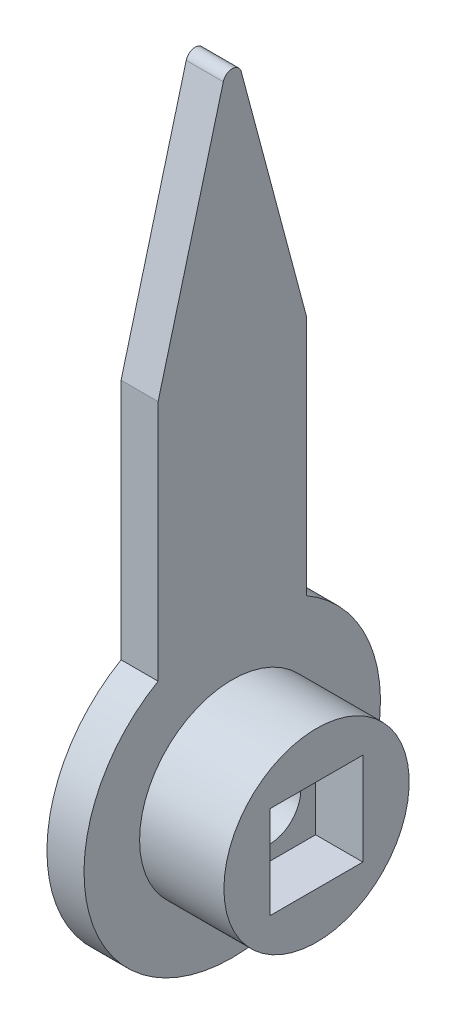
ISO-10303-21;
HEADER;
FILE_DESCRIPTION(('STEP AP214'),'2;1');
FILE_NAME('part.step','',(''),(''),'','','');
FILE_SCHEMA(('AUTOMOTIVE_DESIGN { 1 0 10303 214 1 1 1 1 }'));
ENDSEC;
DATA;
#1=APPLICATION_CONTEXT('core data for automotive mechanical design processes');
#2=APPLICATION_PROTOCOL_DEFINITION('international standard','automotive_design',2000,#1);
#3=PRODUCT_CONTEXT('',#1,'mechanical');
#4=PRODUCT('Part','Part','',(#3));
#5=PRODUCT_RELATED_PRODUCT_CATEGORY('part','',(#4));
#6=PRODUCT_DEFINITION_FORMATION('','',#4);
#7=PRODUCT_DEFINITION_CONTEXT('part definition',#1,'design');
#8=PRODUCT_DEFINITION('design','',#6,#7);
#9=PRODUCT_DEFINITION_SHAPE('','',#8);
#10=(LENGTH_UNIT() NAMED_UNIT(*) SI_UNIT(.MILLI.,.METRE.));
#11=(NAMED_UNIT(*) PLANE_ANGLE_UNIT() SI_UNIT($,.RADIAN.));
#12=(NAMED_UNIT(*) SI_UNIT($,.STERADIAN.) SOLID_ANGLE_UNIT());
#13=UNCERTAINTY_MEASURE_WITH_UNIT(LENGTH_MEASURE(1.E-05),#10,'distance_accuracy_value','');
#14=(GEOMETRIC_REPRESENTATION_CONTEXT(3) GLOBAL_UNCERTAINTY_ASSIGNED_CONTEXT((#13)) GLOBAL_UNIT_ASSIGNED_CONTEXT((#10,
#11,#12)) REPRESENTATION_CONTEXT('',''));
#15=CARTESIAN_POINT('',(0.,0.,0.));
#16=DIRECTION('',(0.,0.,1.));
#17=DIRECTION('',(1.,0.,0.));
#18=AXIS2_PLACEMENT_3D('',#15,#16,#17);
#19=CARTESIAN_POINT('',(14.6921356237304,0.,-2.5));
#20=DIRECTION('',(0.,0.,1.));
#21=DIRECTION('',(1.,0.,0.));
#22=AXIS2_PLACEMENT_3D('',#19,#20,#21);
#23=PLANE('',#22);
#24=DIRECTION('',(0.,-1.,0.));
#25=VECTOR('',#24,1.);
#26=CARTESIAN_POINT('',(0.55,0.,-2.5));
#27=LINE('',#26,#25);
#28=CARTESIAN_POINT('',(0.55,2.5,-2.5));
#29=VERTEX_POINT('',#28);
#30=CARTESIAN_POINT('',(0.55,-2.5,-2.5));
#31=VERTEX_POINT('',#30);
#32=EDGE_CURVE('E92',#29,#31,#27,.T.);
#33=ORIENTED_EDGE('',*,*,#32,.F.);
#34=DIRECTION('',(-1.,0.,0.));
#35=VECTOR('',#34,1.);
#36=CARTESIAN_POINT('',(14.6921356237304,2.5,-2.5));
#37=LINE('',#36,#35);
#38=CARTESIAN_POINT('',(-2.,2.5,-2.5));
#39=VERTEX_POINT('',#38);
#40=EDGE_CURVE('E199',#29,#39,#37,.T.);
#41=ORIENTED_EDGE('',*,*,#40,.T.);
#42=DIRECTION('',(0.,1.,0.));
#43=VECTOR('',#42,1.);
#44=CARTESIAN_POINT('',(-2.,0.,-2.5));
#45=LINE('',#44,#43);
#46=CARTESIAN_POINT('',(-2.,-2.5,-2.5));
#47=VERTEX_POINT('',#46);
#48=EDGE_CURVE('E210',#47,#39,#45,.T.);
#49=ORIENTED_EDGE('',*,*,#48,.F.);
#50=DIRECTION('',(-1.,0.,0.));
#51=VECTOR('',#50,1.);
#52=CARTESIAN_POINT('',(14.6921356237304,-2.5,-2.5));
#53=LINE('',#52,#51);
#54=EDGE_CURVE('E213',#31,#47,#53,.T.);
#55=ORIENTED_EDGE('',*,*,#54,.F.);
#56=EDGE_LOOP('',(#33,#41,#49,#55));
#57=FACE_BOUND('',#56,.T.);
#58=ADVANCED_FACE('F57',(#57),#23,.T.);
#59=CARTESIAN_POINT('',(14.6921356237304,-2.5,0.));
#60=DIRECTION('',(0.,1.,0.));
#61=DIRECTION('',(0.,0.,1.));
#62=AXIS2_PLACEMENT_3D('',#59,#60,#61);
#63=PLANE('',#62);
#64=DIRECTION('',(0.,0.,1.));
#65=VECTOR('',#64,1.);
#66=CARTESIAN_POINT('',(0.55,-2.5,0.));
#67=LINE('',#66,#65);
#68=CARTESIAN_POINT('',(0.55,-2.5,2.5));
#69=VERTEX_POINT('',#68);
#70=EDGE_CURVE('E94',#31,#69,#67,.T.);
#71=ORIENTED_EDGE('',*,*,#70,.F.);
#72=ORIENTED_EDGE('',*,*,#54,.T.);
#73=DIRECTION('',(0.,0.,-1.));
#74=VECTOR('',#73,1.);
#75=CARTESIAN_POINT('',(-2.,-2.5,0.));
#76=LINE('',#75,#74);
#77=CARTESIAN_POINT('',(-2.,-2.5,2.5));
#78=VERTEX_POINT('',#77);
#79=EDGE_CURVE('E200',#78,#47,#76,.T.);
#80=ORIENTED_EDGE('',*,*,#79,.F.);
#81=DIRECTION('',(-1.,0.,0.));
#82=VECTOR('',#81,1.);
#83=CARTESIAN_POINT('',(14.6921356237304,-2.5,2.5));
#84=LINE('',#83,#82);
#85=EDGE_CURVE('E216',#69,#78,#84,.T.);
#86=ORIENTED_EDGE('',*,*,#85,.F.);
#87=EDGE_LOOP('',(#71,#72,#80,#86));
#88=FACE_BOUND('',#87,.T.);
#89=ADVANCED_FACE('F233',(#88),#63,.T.);
#90=CARTESIAN_POINT('',(14.6921356237304,0.,2.5));
#91=DIRECTION('',(0.,0.,-1.));
#92=DIRECTION('',(-1.,0.,0.));
#93=AXIS2_PLACEMENT_3D('',#90,#91,#92);
#94=PLANE('',#93);
#95=DIRECTION('',(0.,1.,0.));
#96=VECTOR('',#95,1.);
#97=CARTESIAN_POINT('',(0.55,0.,2.5));
#98=LINE('',#97,#96);
#99=CARTESIAN_POINT('',(0.55,2.5,2.5));
#100=VERTEX_POINT('',#99);
#101=EDGE_CURVE('E67',#69,#100,#98,.T.);
#102=ORIENTED_EDGE('',*,*,#101,.F.);
#103=ORIENTED_EDGE('',*,*,#85,.T.);
#104=DIRECTION('',(0.,-1.,0.));
#105=VECTOR('',#104,1.);
#106=CARTESIAN_POINT('',(-2.,0.,2.5));
#107=LINE('',#106,#105);
#108=CARTESIAN_POINT('',(-2.,2.5,2.5));
#109=VERTEX_POINT('',#108);
#110=EDGE_CURVE('E204',#109,#78,#107,.T.);
#111=ORIENTED_EDGE('',*,*,#110,.F.);
#112=DIRECTION('',(-1.,0.,0.));
#113=VECTOR('',#112,1.);
#114=CARTESIAN_POINT('',(14.6921356237304,2.5,2.5));
#115=LINE('',#114,#113);
#116=EDGE_CURVE('E89',#100,#109,#115,.T.);
#117=ORIENTED_EDGE('',*,*,#116,.F.);
#118=EDGE_LOOP('',(#102,#103,#111,#117));
#119=FACE_BOUND('',#118,.T.);
#120=ADVANCED_FACE('F226',(#119),#94,.T.);
#121=CARTESIAN_POINT('',(14.6921356237304,0.,0.));
#122=DIRECTION('',(-1.,0.,0.));
#123=DIRECTION('',(0.,0.,1.));
#124=AXIS2_PLACEMENT_3D('',#121,#122,#123);
#125=CYLINDRICAL_SURFACE('',#124,4.9999999999998);
#126=CARTESIAN_POINT('',(0.55,0.,0.));
#127=DIRECTION('',(-1.,0.,0.));
#128=DIRECTION('',(0.,0.,1.));
#129=AXIS2_PLACEMENT_3D('',#126,#127,#128);
#130=CIRCLE('',#129,4.9999999999998);
#131=CARTESIAN_POINT('',(0.55,0.,4.9999999999998));
#132=VERTEX_POINT('',#131);
#133=EDGE_CURVE('E203',#132,#132,#130,.F.);
#134=ORIENTED_EDGE('',*,*,#133,.F.);
#135=EDGE_LOOP('',(#134));
#136=FACE_BOUND('',#135,.T.);
#137=CARTESIAN_POINT('',(-4.,0.,0.));
#138=DIRECTION('',(-1.,0.,0.));
#139=DIRECTION('',(0.,0.,1.));
#140=AXIS2_PLACEMENT_3D('',#137,#138,#139);
#141=CIRCLE('',#140,4.9999999999998);
#142=CARTESIAN_POINT('',(-4.,0.,4.9999999999998));
#143=VERTEX_POINT('',#142);
#144=EDGE_CURVE('E196',#143,#143,#141,.T.);
#145=ORIENTED_EDGE('',*,*,#144,.F.);
#146=EDGE_LOOP('',(#145));
#147=FACE_BOUND('',#146,.T.);
#148=ADVANCED_FACE('F256',(#136,#147),#125,.T.);
#149=CARTESIAN_POINT('',(14.6921356237304,2.5,0.));
#150=DIRECTION('',(0.,-1.,0.));
#151=DIRECTION('',(0.,0.,-1.));
#152=AXIS2_PLACEMENT_3D('',#149,#150,#151);
#153=PLANE('',#152);
#154=DIRECTION('',(0.,0.,-1.));
#155=VECTOR('',#154,1.);
#156=CARTESIAN_POINT('',(0.55,2.5,0.));
#157=LINE('',#156,#155);
#158=EDGE_CURVE('E12',#100,#29,#157,.T.);
#159=ORIENTED_EDGE('',*,*,#158,.F.);
#160=ORIENTED_EDGE('',*,*,#116,.T.);
#161=DIRECTION('',(0.,0.,1.));
#162=VECTOR('',#161,1.);
#163=CARTESIAN_POINT('',(-2.,2.5,0.));
#164=LINE('',#163,#162);
#165=EDGE_CURVE('E207',#39,#109,#164,.T.);
#166=ORIENTED_EDGE('',*,*,#165,.F.);
#167=ORIENTED_EDGE('',*,*,#40,.F.);
#168=EDGE_LOOP('',(#159,#160,#166,#167));
#169=FACE_BOUND('',#168,.T.);
#170=ADVANCED_FACE('F228',(#169),#153,.T.);
#171=CARTESIAN_POINT('',(0.55,0.,0.));
#172=DIRECTION('',(-1.,0.,0.));
#173=DIRECTION('',(0.,0.,1.));
#174=AXIS2_PLACEMENT_3D('',#171,#172,#173);
#175=PLANE('',#174);
#176=ORIENTED_EDGE('',*,*,#133,.T.);
#177=EDGE_LOOP('',(#176));
#178=FACE_BOUND('',#177,.T.);
#179=ORIENTED_EDGE('',*,*,#32,.T.);
#180=ORIENTED_EDGE('',*,*,#70,.T.);
#181=ORIENTED_EDGE('',*,*,#101,.T.);
#182=ORIENTED_EDGE('',*,*,#158,.T.);
#183=EDGE_LOOP('',(#179,#180,#181,#182));
#184=FACE_BOUND('',#183,.T.);
#185=ADVANCED_FACE('F59',(#178,#184),#175,.F.);
#186=CARTESIAN_POINT('',(-2.,0.,0.));
#187=DIRECTION('',(-1.,0.,0.));
#188=DIRECTION('',(0.,0.,1.));
#189=AXIS2_PLACEMENT_3D('',#186,#187,#188);
#190=PLANE('',#189);
#191=CARTESIAN_POINT('',(-2.,0.,0.));
#192=DIRECTION('',(-1.,0.,0.));
#193=DIRECTION('',(0.,0.,1.));
#194=AXIS2_PLACEMENT_3D('',#191,#192,#193);
#195=CIRCLE('',#194,1.7);
#196=CARTESIAN_POINT('',(-2.,0.,1.7));
#197=VERTEX_POINT('',#196);
#198=EDGE_CURVE('E428',#197,#197,#195,.T.);
#199=ORIENTED_EDGE('',*,*,#198,.T.);
#200=EDGE_LOOP('',(#199));
#201=FACE_BOUND('',#200,.T.);
#202=ORIENTED_EDGE('',*,*,#79,.T.);
#203=ORIENTED_EDGE('',*,*,#48,.T.);
#204=ORIENTED_EDGE('',*,*,#165,.T.);
#205=ORIENTED_EDGE('',*,*,#110,.T.);
#206=EDGE_LOOP('',(#202,#203,#204,#205));
#207=FACE_BOUND('',#206,.T.);
#208=ADVANCED_FACE('F235',(#201,#207),#190,.F.);
#209=CARTESIAN_POINT('',(-6.,0.,0.));
#210=DIRECTION('',(1.,0.,0.));
#211=DIRECTION('',(0.,0.,-1.));
#212=AXIS2_PLACEMENT_3D('',#209,#210,#211);
#213=CYLINDRICAL_SURFACE('',#212,8.);
#214=CARTESIAN_POINT('',(-6.,0.,0.));
#215=DIRECTION('',(-1.,0.,0.));
#216=DIRECTION('',(0.,0.,1.));
#217=AXIS2_PLACEMENT_3D('',#214,#215,#216);
#218=CIRCLE('',#217,8.);
#219=CARTESIAN_POINT('',(-6.,6.92820323027551,-4.));
#220=VERTEX_POINT('',#219);
#221=CARTESIAN_POINT('',(-6.,6.92820323027551,4.));
#222=VERTEX_POINT('',#221);
#223=EDGE_CURVE('E149',#220,#222,#218,.T.);
#224=ORIENTED_EDGE('',*,*,#223,.F.);
#225=DIRECTION('',(1.,0.,0.));
#226=VECTOR('',#225,1.);
#227=CARTESIAN_POINT('',(-6.,6.92820323027551,-4.));
#228=LINE('',#227,#226);
#229=CARTESIAN_POINT('',(-4.,6.92820323027551,-4.));
#230=VERTEX_POINT('',#229);
#231=EDGE_CURVE('E148',#220,#230,#228,.T.);
#232=ORIENTED_EDGE('',*,*,#231,.T.);
#233=CARTESIAN_POINT('',(-4.,0.,0.));
#234=DIRECTION('',(-1.,0.,0.));
#235=DIRECTION('',(0.,0.,1.));
#236=AXIS2_PLACEMENT_3D('',#233,#234,#235);
#237=CIRCLE('',#236,8.);
#238=CARTESIAN_POINT('',(-4.,6.92820323027551,4.));
#239=VERTEX_POINT('',#238);
#240=EDGE_CURVE('E155',#230,#239,#237,.T.);
#241=ORIENTED_EDGE('',*,*,#240,.T.);
#242=DIRECTION('',(1.,0.,0.));
#243=VECTOR('',#242,1.);
#244=CARTESIAN_POINT('',(-6.,6.92820323027551,4.));
#245=LINE('',#244,#243);
#246=EDGE_CURVE('E137',#222,#239,#245,.T.);
#247=ORIENTED_EDGE('',*,*,#246,.F.);
#248=EDGE_LOOP('',(#224,#232,#241,#247));
#249=FACE_BOUND('',#248,.T.);
#250=ADVANCED_FACE('F160',(#249),#213,.T.);
#251=CARTESIAN_POINT('',(-4.,0.,0.));
#252=DIRECTION('',(-1.,0.,0.));
#253=DIRECTION('',(0.,0.,1.));
#254=AXIS2_PLACEMENT_3D('',#251,#252,#253);
#255=PLANE('',#254);
#256=ORIENTED_EDGE('',*,*,#144,.T.);
#257=EDGE_LOOP('',(#256));
#258=FACE_BOUND('',#257,.T.);
#259=ORIENTED_EDGE('',*,*,#240,.F.);
#260=DIRECTION('',(0.,1.,0.));
#261=VECTOR('',#260,1.);
#262=CARTESIAN_POINT('',(-4.,0.,-4.));
#263=LINE('',#262,#261);
#264=CARTESIAN_POINT('',(-4.,20.,-4.));
#265=VERTEX_POINT('',#264);
#266=EDGE_CURVE('E158',#230,#265,#263,.T.);
#267=ORIENTED_EDGE('',*,*,#266,.T.);
#268=DIRECTION('',(0.,-0.966234939601246,-0.257662650560332));
#269=VECTOR('',#268,1.);
#270=CARTESIAN_POINT('',(-4.,2.32365145228216,-8.71369294605809));
#271=LINE('',#270,#269);
#272=CARTESIAN_POINT('',(-4.,33.1883094882477,-0.483117469800626));
#273=VERTEX_POINT('',#272);
#274=EDGE_CURVE('E182',#273,#265,#271,.T.);
#275=ORIENTED_EDGE('',*,*,#274,.F.);
#276=CARTESIAN_POINT('',(-4.,33.0594781629675,0.));
#277=DIRECTION('',(-1.,0.,0.));
#278=DIRECTION('',(0.,0.,1.));
#279=AXIS2_PLACEMENT_3D('',#276,#277,#278);
#280=CIRCLE('',#279,0.5);
#281=CARTESIAN_POINT('',(-4.,33.1883094882477,0.483117469800621));
#282=VERTEX_POINT('',#281);
#283=EDGE_CURVE('E174',#282,#273,#280,.T.);
#284=ORIENTED_EDGE('',*,*,#283,.F.);
#285=DIRECTION('',(0.,0.966234939601246,-0.257662650560332));
#286=VECTOR('',#285,1.);
#287=CARTESIAN_POINT('',(-4.,2.32365145228216,8.71369294605809));
#288=LINE('',#287,#286);
#289=CARTESIAN_POINT('',(-4.,20.,4.));
#290=VERTEX_POINT('',#289);
#291=EDGE_CURVE('E157',#290,#282,#288,.T.);
#292=ORIENTED_EDGE('',*,*,#291,.F.);
#293=DIRECTION('',(0.,1.,0.));
#294=VECTOR('',#293,1.);
#295=CARTESIAN_POINT('',(-4.,0.,4.));
#296=LINE('',#295,#294);
#297=EDGE_CURVE('E141',#239,#290,#296,.T.);
#298=ORIENTED_EDGE('',*,*,#297,.F.);
#299=EDGE_LOOP('',(#259,#267,#275,#284,#292,#298));
#300=FACE_BOUND('',#299,.T.);
#301=ADVANCED_FACE('F154',(#258,#300),#255,.F.);
#302=CARTESIAN_POINT('',(-6.,0.,0.));
#303=DIRECTION('',(-1.,0.,0.));
#304=DIRECTION('',(0.,0.,1.));
#305=AXIS2_PLACEMENT_3D('',#302,#303,#304);
#306=PLANE('',#305);
#307=CARTESIAN_POINT('',(-6.,0.,0.));
#308=DIRECTION('',(-1.,0.,0.));
#309=DIRECTION('',(0.,0.,1.));
#310=AXIS2_PLACEMENT_3D('',#307,#308,#309);
#311=CIRCLE('',#310,2.85);
#312=CARTESIAN_POINT('',(-6.,0.,2.85));
#313=VERTEX_POINT('',#312);
#314=EDGE_CURVE('E429',#313,#313,#311,.T.);
#315=ORIENTED_EDGE('',*,*,#314,.F.);
#316=EDGE_LOOP('',(#315));
#317=FACE_BOUND('',#316,.T.);
#318=ORIENTED_EDGE('',*,*,#223,.T.);
#319=DIRECTION('',(0.,1.,0.));
#320=VECTOR('',#319,1.);
#321=CARTESIAN_POINT('',(-6.,0.,4.));
#322=LINE('',#321,#320);
#323=CARTESIAN_POINT('',(-6.,20.,4.));
#324=VERTEX_POINT('',#323);
#325=EDGE_CURVE('E143',#222,#324,#322,.T.);
#326=ORIENTED_EDGE('',*,*,#325,.T.);
#327=DIRECTION('',(0.,0.966234939601246,-0.257662650560332));
#328=VECTOR('',#327,1.);
#329=CARTESIAN_POINT('',(-6.,2.32365145228216,8.71369294605809));
#330=LINE('',#329,#328);
#331=CARTESIAN_POINT('',(-6.,33.1883094882477,0.483117469800621));
#332=VERTEX_POINT('',#331);
#333=EDGE_CURVE('E177',#324,#332,#330,.T.);
#334=ORIENTED_EDGE('',*,*,#333,.T.);
#335=CARTESIAN_POINT('',(-6.,33.0594781629675,0.));
#336=DIRECTION('',(-1.,0.,0.));
#337=DIRECTION('',(0.,0.,1.));
#338=AXIS2_PLACEMENT_3D('',#335,#336,#337);
#339=CIRCLE('',#338,0.5);
#340=CARTESIAN_POINT('',(-6.,33.1883094882477,-0.483117469800626));
#341=VERTEX_POINT('',#340);
#342=EDGE_CURVE('E179',#332,#341,#339,.T.);
#343=ORIENTED_EDGE('',*,*,#342,.T.);
#344=DIRECTION('',(0.,-0.966234939601246,-0.257662650560332));
#345=VECTOR('',#344,1.);
#346=CARTESIAN_POINT('',(-6.,2.32365145228216,-8.71369294605809));
#347=LINE('',#346,#345);
#348=CARTESIAN_POINT('',(-6.,20.,-4.));
#349=VERTEX_POINT('',#348);
#350=EDGE_CURVE('E170',#341,#349,#347,.T.);
#351=ORIENTED_EDGE('',*,*,#350,.T.);
#352=DIRECTION('',(0.,1.,0.));
#353=VECTOR('',#352,1.);
#354=CARTESIAN_POINT('',(-6.,0.,-4.));
#355=LINE('',#354,#353);
#356=EDGE_CURVE('E173',#220,#349,#355,.T.);
#357=ORIENTED_EDGE('',*,*,#356,.F.);
#358=EDGE_LOOP('',(#318,#326,#334,#343,#351,#357));
#359=FACE_BOUND('',#358,.T.);
#360=ADVANCED_FACE('F267',(#317,#359),#306,.T.);
#361=CARTESIAN_POINT('',(-6.,2.32365145228216,8.71369294605809));
#362=DIRECTION('',(0.,-0.257662650560332,-0.966234939601246));
#363=DIRECTION('',(0.,0.966234939601246,-0.257662650560332));
#364=AXIS2_PLACEMENT_3D('',#361,#362,#363);
#365=PLANE('',#364);
#366=ORIENTED_EDGE('',*,*,#291,.T.);
#367=DIRECTION('',(1.,0.,0.));
#368=VECTOR('',#367,1.);
#369=CARTESIAN_POINT('',(-6.,33.1883094882477,0.483117469800621));
#370=LINE('',#369,#368);
#371=EDGE_CURVE('E191',#332,#282,#370,.T.);
#372=ORIENTED_EDGE('',*,*,#371,.F.);
#373=ORIENTED_EDGE('',*,*,#333,.F.);
#374=DIRECTION('',(1.,0.,0.));
#375=VECTOR('',#374,1.);
#376=CARTESIAN_POINT('',(-6.,20.,4.));
#377=LINE('',#376,#375);
#378=EDGE_CURVE('E166',#324,#290,#377,.T.);
#379=ORIENTED_EDGE('',*,*,#378,.T.);
#380=EDGE_LOOP('',(#366,#372,#373,#379));
#381=FACE_BOUND('',#380,.T.);
#382=ADVANCED_FACE('F272',(#381),#365,.F.);
#383=CARTESIAN_POINT('',(-6.,33.0594781629675,0.));
#384=DIRECTION('',(1.,0.,0.));
#385=DIRECTION('',(0.,0.,-1.));
#386=AXIS2_PLACEMENT_3D('',#383,#384,#385);
#387=CYLINDRICAL_SURFACE('',#386,0.5);
#388=ORIENTED_EDGE('',*,*,#283,.T.);
#389=DIRECTION('',(1.,0.,0.));
#390=VECTOR('',#389,1.);
#391=CARTESIAN_POINT('',(-6.,33.1883094882477,-0.483117469800626));
#392=LINE('',#391,#390);
#393=EDGE_CURVE('E181',#341,#273,#392,.T.);
#394=ORIENTED_EDGE('',*,*,#393,.F.);
#395=ORIENTED_EDGE('',*,*,#342,.F.);
#396=ORIENTED_EDGE('',*,*,#371,.T.);
#397=EDGE_LOOP('',(#388,#394,#395,#396));
#398=FACE_BOUND('',#397,.T.);
#399=ADVANCED_FACE('F278',(#398),#387,.T.);
#400=CARTESIAN_POINT('',(-6.,2.32365145228216,-8.71369294605809));
#401=DIRECTION('',(0.,-0.257662650560332,0.966234939601246));
#402=DIRECTION('',(0.,-0.966234939601246,-0.257662650560332));
#403=AXIS2_PLACEMENT_3D('',#400,#401,#402);
#404=PLANE('',#403);
#405=ORIENTED_EDGE('',*,*,#274,.T.);
#406=DIRECTION('',(1.,0.,0.));
#407=VECTOR('',#406,1.);
#408=CARTESIAN_POINT('',(-6.,20.,-4.));
#409=LINE('',#408,#407);
#410=EDGE_CURVE('E162',#349,#265,#409,.T.);
#411=ORIENTED_EDGE('',*,*,#410,.F.);
#412=ORIENTED_EDGE('',*,*,#350,.F.);
#413=ORIENTED_EDGE('',*,*,#393,.T.);
#414=EDGE_LOOP('',(#405,#411,#412,#413));
#415=FACE_BOUND('',#414,.T.);
#416=ADVANCED_FACE('F281',(#415),#404,.F.);
#417=CARTESIAN_POINT('',(-6.,0.,-4.));
#418=DIRECTION('',(0.,0.,-1.));
#419=DIRECTION('',(0.,1.,0.));
#420=AXIS2_PLACEMENT_3D('',#417,#418,#419);
#421=PLANE('',#420);
#422=ORIENTED_EDGE('',*,*,#231,.F.);
#423=ORIENTED_EDGE('',*,*,#356,.T.);
#424=ORIENTED_EDGE('',*,*,#410,.T.);
#425=ORIENTED_EDGE('',*,*,#266,.F.);
#426=EDGE_LOOP('',(#422,#423,#424,#425));
#427=FACE_BOUND('',#426,.T.);
#428=ADVANCED_FACE('F275',(#427),#421,.T.);
#429=CARTESIAN_POINT('',(-6.,0.,4.));
#430=DIRECTION('',(0.,0.,-1.));
#431=DIRECTION('',(0.,1.,0.));
#432=AXIS2_PLACEMENT_3D('',#429,#430,#431);
#433=PLANE('',#432);
#434=ORIENTED_EDGE('',*,*,#325,.F.);
#435=ORIENTED_EDGE('',*,*,#246,.T.);
#436=ORIENTED_EDGE('',*,*,#297,.T.);
#437=ORIENTED_EDGE('',*,*,#378,.F.);
#438=EDGE_LOOP('',(#434,#435,#436,#437));
#439=FACE_BOUND('',#438,.T.);
#440=ADVANCED_FACE('F139',(#439),#433,.F.);
#441=CARTESIAN_POINT('',(-3.5,0.,0.));
#442=DIRECTION('',(-1.,0.,0.));
#443=DIRECTION('',(0.,0.,1.));
#444=AXIS2_PLACEMENT_3D('',#441,#442,#443);
#445=CYLINDRICAL_SURFACE('',#444,2.85);
#446=CARTESIAN_POINT('',(-3.5,0.,0.));
#447=DIRECTION('',(-1.,0.,0.));
#448=DIRECTION('',(0.,0.,1.));
#449=AXIS2_PLACEMENT_3D('',#446,#447,#448);
#450=CIRCLE('',#449,2.85);
#451=CARTESIAN_POINT('',(-3.5,0.,2.85));
#452=VERTEX_POINT('',#451);
#453=EDGE_CURVE('E185',#452,#452,#450,.T.);
#454=ORIENTED_EDGE('',*,*,#453,.F.);
#455=EDGE_LOOP('',(#454));
#456=FACE_BOUND('',#455,.T.);
#457=ORIENTED_EDGE('',*,*,#314,.T.);
#458=EDGE_LOOP('',(#457));
#459=FACE_BOUND('',#458,.T.);
#460=ADVANCED_FACE('F283',(#456,#459),#445,.F.);
#461=CARTESIAN_POINT('',(-3.5,0.,0.));
#462=DIRECTION('',(-1.,0.,0.));
#463=DIRECTION('',(0.,0.,1.));
#464=AXIS2_PLACEMENT_3D('',#461,#462,#463);
#465=PLANE('',#464);
#466=CARTESIAN_POINT('',(-3.5,0.,0.));
#467=DIRECTION('',(-1.,0.,0.));
#468=DIRECTION('',(0.,0.,1.));
#469=AXIS2_PLACEMENT_3D('',#466,#467,#468);
#470=CIRCLE('',#469,1.7);
#471=CARTESIAN_POINT('',(-3.5,0.,1.7));
#472=VERTEX_POINT('',#471);
#473=EDGE_CURVE('E61',#472,#472,#470,.T.);
#474=ORIENTED_EDGE('',*,*,#473,.F.);
#475=EDGE_LOOP('',(#474));
#476=FACE_BOUND('',#475,.T.);
#477=ORIENTED_EDGE('',*,*,#453,.T.);
#478=EDGE_LOOP('',(#477));
#479=FACE_BOUND('',#478,.T.);
#480=ADVANCED_FACE('F321',(#476,#479),#465,.T.);
#481=CARTESIAN_POINT('',(0.55,0.,0.));
#482=DIRECTION('',(-1.,0.,0.));
#483=DIRECTION('',(0.,0.,1.));
#484=AXIS2_PLACEMENT_3D('',#481,#482,#483);
#485=CYLINDRICAL_SURFACE('',#484,1.7);
#486=CARTESIAN_POINT('',(-3.5,0.,1.7));
#487=CARTESIAN_POINT('',(-3.484375,0.,1.7));
#488=CARTESIAN_POINT('',(-3.46875,0.,1.7));
#489=CARTESIAN_POINT('',(-3.4375,0.,1.7));
#490=CARTESIAN_POINT('',(-3.421875,0.,1.7));
#491=CARTESIAN_POINT('',(-3.390625,0.,1.7));
#492=CARTESIAN_POINT('',(-3.375,0.,1.7));
#493=CARTESIAN_POINT('',(-3.34375,0.,1.7));
#494=CARTESIAN_POINT('',(-3.328125,0.,1.7));
#495=CARTESIAN_POINT('',(-3.296875,0.,1.7));
#496=CARTESIAN_POINT('',(-3.28125,0.,1.7));
#497=CARTESIAN_POINT('',(-3.25,0.,1.7));
#498=CARTESIAN_POINT('',(-3.234375,0.,1.7));
#499=CARTESIAN_POINT('',(-3.203125,0.,1.7));
#500=CARTESIAN_POINT('',(-3.1875,0.,1.7));
#501=CARTESIAN_POINT('',(-3.15625,0.,1.7));
#502=CARTESIAN_POINT('',(-3.140625,0.,1.7));
#503=CARTESIAN_POINT('',(-3.109375,0.,1.7));
#504=CARTESIAN_POINT('',(-3.09375,0.,1.7));
#505=CARTESIAN_POINT('',(-3.0625,0.,1.7));
#506=CARTESIAN_POINT('',(-3.046875,0.,1.7));
#507=CARTESIAN_POINT('',(-3.015625,0.,1.7));
#508=CARTESIAN_POINT('',(-3.,0.,1.7));
#509=CARTESIAN_POINT('',(-2.96875,0.,1.7));
#510=CARTESIAN_POINT('',(-2.953125,0.,1.7));
#511=CARTESIAN_POINT('',(-2.921875,0.,1.7));
#512=CARTESIAN_POINT('',(-2.90625,0.,1.7));
#513=CARTESIAN_POINT('',(-2.875,0.,1.7));
#514=CARTESIAN_POINT('',(-2.859375,0.,1.7));
#515=CARTESIAN_POINT('',(-2.828125,0.,1.7));
#516=CARTESIAN_POINT('',(-2.8125,0.,1.7));
#517=CARTESIAN_POINT('',(-2.78125,0.,1.7));
#518=CARTESIAN_POINT('',(-2.765625,0.,1.7));
#519=CARTESIAN_POINT('',(-2.734375,0.,1.7));
#520=CARTESIAN_POINT('',(-2.71875,0.,1.7));
#521=CARTESIAN_POINT('',(-2.6875,0.,1.7));
#522=CARTESIAN_POINT('',(-2.671875,0.,1.7));
#523=CARTESIAN_POINT('',(-2.640625,0.,1.7));
#524=CARTESIAN_POINT('',(-2.625,0.,1.7));
#525=CARTESIAN_POINT('',(-2.59375,0.,1.7));
#526=CARTESIAN_POINT('',(-2.578125,0.,1.7));
#527=CARTESIAN_POINT('',(-2.546875,0.,1.7));
#528=CARTESIAN_POINT('',(-2.53125,0.,1.7));
#529=CARTESIAN_POINT('',(-2.5,0.,1.7));
#530=CARTESIAN_POINT('',(-2.484375,0.,1.7));
#531=CARTESIAN_POINT('',(-2.453125,0.,1.7));
#532=CARTESIAN_POINT('',(-2.4375,0.,1.7));
#533=CARTESIAN_POINT('',(-2.40625,0.,1.7));
#534=CARTESIAN_POINT('',(-2.390625,0.,1.7));
#535=CARTESIAN_POINT('',(-2.359375,0.,1.7));
#536=CARTESIAN_POINT('',(-2.34375,0.,1.7));
#537=CARTESIAN_POINT('',(-2.3125,0.,1.7));
#538=CARTESIAN_POINT('',(-2.296875,0.,1.7));
#539=CARTESIAN_POINT('',(-2.265625,0.,1.7));
#540=CARTESIAN_POINT('',(-2.25,0.,1.7));
#541=CARTESIAN_POINT('',(-2.21875,0.,1.7));
#542=CARTESIAN_POINT('',(-2.203125,0.,1.7));
#543=CARTESIAN_POINT('',(-2.171875,0.,1.7));
#544=CARTESIAN_POINT('',(-2.15625,0.,1.7));
#545=CARTESIAN_POINT('',(-2.125,0.,1.7));
#546=CARTESIAN_POINT('',(-2.109375,0.,1.7));
#547=CARTESIAN_POINT('',(-2.078125,0.,1.7));
#548=CARTESIAN_POINT('',(-2.0625,0.,1.7));
#549=CARTESIAN_POINT('',(-2.03125,0.,1.7));
#550=CARTESIAN_POINT('',(-2.015625,0.,1.7));
#551=CARTESIAN_POINT('',(-2.,0.,1.7));
#552=B_SPLINE_CURVE_WITH_KNOTS('',3,(#486,#487,#488,#489,#490,#491,#492,#493,#494,#495,#496,
#497,#498,#499,#500,#501,#502,#503,#504,#505,#506,#507,#508,#509,#510,#511,#512,#513,#514,#515,
#516,#517,#518,#519,#520,#521,#522,#523,#524,#525,#526,#527,#528,#529,#530,#531,#532,#533,#534,
#535,#536,#537,#538,#539,#540,#541,#542,#543,#544,#545,#546,#547,#548,#549,#550,#551),
.UNSPECIFIED.,.F.,.F.,(4,2,2,2,2,2,2,2,2,2,2,2,2,2,2,2,2,2,2,2,2,2,2,2,2,2,2,2,2,2,2,2,4),(0.,
0.046875,0.0937500000000001,0.140625,0.1875,0.234374999999999,0.281249999999999,
0.328124999999999,0.374999999999999,0.421875,0.46875,0.515624999999999,0.562499999999999,
0.609374999999999,0.656249999999999,0.703124999999999,0.749999999999999,0.796874999999999,
0.843749999999999,0.890624999999999,0.9375,0.984375,1.03125,1.078125,1.125,1.171875,1.21875,
1.265625,1.3125,1.359375,1.40625,1.453125,1.5),.UNSPECIFIED.);
#553=EDGE_CURVE('BSEAM328',#472,#197,#552,.T.);
#554=ORIENTED_EDGE('',*,*,#473,.T.);
#555=ORIENTED_EDGE('',*,*,#198,.F.);
#556=ORIENTED_EDGE('',*,*,#553,.T.);
#557=ORIENTED_EDGE('',*,*,#553,.F.);
#558=EDGE_LOOP('',(#554,#556,#555,#557));
#559=FACE_BOUND('',#558,.T.);
#560=ADVANCED_FACE('F328',(#559),#485,.F.);
#561=CLOSED_SHELL('',(#58,#89,#120,#148,#170,#185,#208,#250,#301,#360,#382,#399,#416,#428,#440,
#460,#480,#560));
#562=MANIFOLD_SOLID_BREP('B2',#561);
#563=ADVANCED_BREP_SHAPE_REPRESENTATION('',(#18,#562),#14);
#564=SHAPE_DEFINITION_REPRESENTATION(#9,#563);
ENDSEC;
END-ISO-10303-21;
